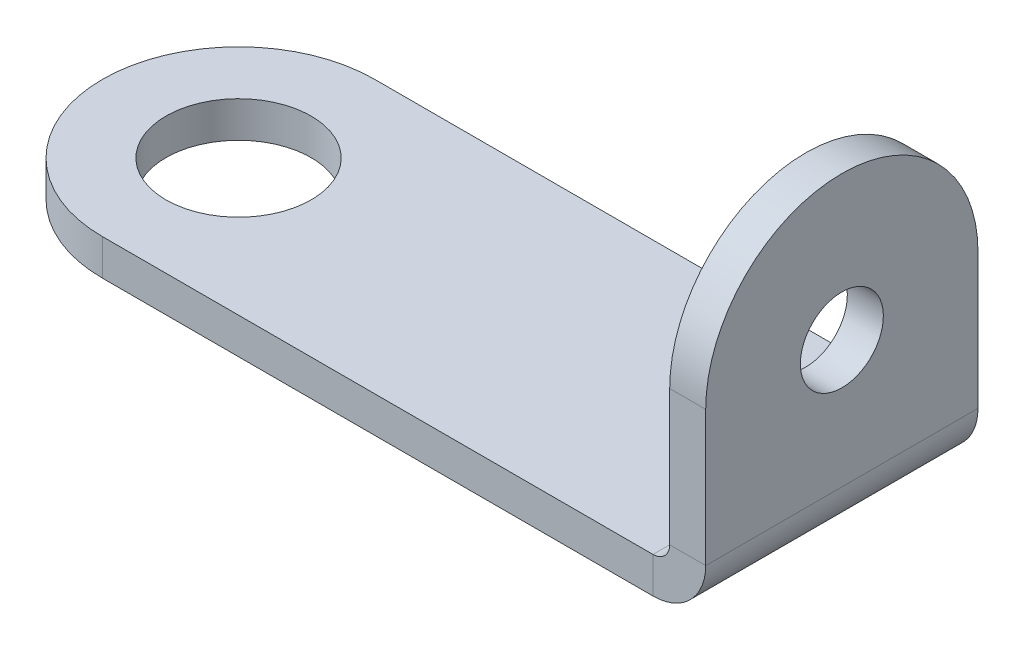
ISO-10303-21;
HEADER;
FILE_DESCRIPTION(('STEP AP214'),'2;1');
FILE_NAME('part.step','',(''),(''),'','','');
FILE_SCHEMA(('AUTOMOTIVE_DESIGN { 1 0 10303 214 1 1 1 1 }'));
ENDSEC;
DATA;
#1=APPLICATION_CONTEXT('core data for automotive mechanical design processes');
#2=APPLICATION_PROTOCOL_DEFINITION('international standard','automotive_design',2000,#1);
#3=PRODUCT_CONTEXT('',#1,'mechanical');
#4=PRODUCT('Part','Part','',(#3));
#5=PRODUCT_RELATED_PRODUCT_CATEGORY('part','',(#4));
#6=PRODUCT_DEFINITION_FORMATION('','',#4);
#7=PRODUCT_DEFINITION_CONTEXT('part definition',#1,'design');
#8=PRODUCT_DEFINITION('design','',#6,#7);
#9=PRODUCT_DEFINITION_SHAPE('','',#8);
#10=(LENGTH_UNIT() NAMED_UNIT(*) SI_UNIT(.MILLI.,.METRE.));
#11=(NAMED_UNIT(*) PLANE_ANGLE_UNIT() SI_UNIT($,.RADIAN.));
#12=(NAMED_UNIT(*) SI_UNIT($,.STERADIAN.) SOLID_ANGLE_UNIT());
#13=UNCERTAINTY_MEASURE_WITH_UNIT(LENGTH_MEASURE(1.E-05),#10,'distance_accuracy_value','');
#14=(GEOMETRIC_REPRESENTATION_CONTEXT(3) GLOBAL_UNCERTAINTY_ASSIGNED_CONTEXT((#13)) GLOBAL_UNIT_ASSIGNED_CONTEXT((#10,
#11,#12)) REPRESENTATION_CONTEXT('',''));
#15=CARTESIAN_POINT('',(0.,0.,0.));
#16=DIRECTION('',(0.,0.,1.));
#17=DIRECTION('',(1.,0.,0.));
#18=AXIS2_PLACEMENT_3D('',#15,#16,#17);
#19=CARTESIAN_POINT('',(26.5875,8.28749999999999,0.));
#20=DIRECTION('',(-1.,0.,0.));
#21=DIRECTION('',(0.,-1.,0.));
#22=AXIS2_PLACEMENT_3D('',#19,#20,#21);
#23=CYLINDRICAL_SURFACE('',#22,6.);
#24=DIRECTION('',(-1.,0.,0.));
#25=VECTOR('',#24,1.);
#26=CARTESIAN_POINT('',(26.5875,8.28749999999999,6.));
#27=LINE('',#26,#25);
#28=CARTESIAN_POINT('',(26.5875,8.28749999999999,6.));
#29=VERTEX_POINT('',#28);
#30=CARTESIAN_POINT('',(25.,8.2875,6.));
#31=VERTEX_POINT('',#30);
#32=EDGE_CURVE('E188',#29,#31,#27,.T.);
#33=ORIENTED_EDGE('',*,*,#32,.F.);
#34=CARTESIAN_POINT('',(26.5875,8.28749999999999,0.));
#35=DIRECTION('',(-1.,0.,0.));
#36=DIRECTION('',(0.,-1.,0.));
#37=AXIS2_PLACEMENT_3D('',#34,#35,#36);
#38=CIRCLE('',#37,6.);
#39=CARTESIAN_POINT('',(26.5875,8.28749999999999,-6.));
#40=VERTEX_POINT('',#39);
#41=EDGE_CURVE('E49',#40,#29,#38,.F.);
#42=ORIENTED_EDGE('',*,*,#41,.F.);
#43=DIRECTION('',(-1.,0.,0.));
#44=VECTOR('',#43,1.);
#45=CARTESIAN_POINT('',(26.5875,8.28749999999999,-6.));
#46=LINE('',#45,#44);
#47=CARTESIAN_POINT('',(25.,8.2875,-6.));
#48=VERTEX_POINT('',#47);
#49=EDGE_CURVE('E137',#48,#40,#46,.F.);
#50=ORIENTED_EDGE('',*,*,#49,.F.);
#51=CARTESIAN_POINT('',(25.,8.2875,0.));
#52=DIRECTION('',(-1.,0.,0.));
#53=DIRECTION('',(0.,-1.,0.));
#54=AXIS2_PLACEMENT_3D('',#51,#52,#53);
#55=CIRCLE('',#54,6.);
#56=EDGE_CURVE('E11',#31,#48,#55,.T.);
#57=ORIENTED_EDGE('',*,*,#56,.F.);
#58=EDGE_LOOP('',(#33,#42,#50,#57));
#59=FACE_BOUND('',#58,.T.);
#60=ADVANCED_FACE('F41',(#59),#23,.T.);
#61=CARTESIAN_POINT('',(0.,1.5875,0.));
#62=DIRECTION('',(0.,1.,0.));
#63=DIRECTION('',(0.,0.,1.));
#64=AXIS2_PLACEMENT_3D('',#61,#62,#63);
#65=PLANE('',#64);
#66=CARTESIAN_POINT('',(0.,1.5875,0.));
#67=DIRECTION('',(0.,1.,0.));
#68=DIRECTION('',(0.,0.,1.));
#69=AXIS2_PLACEMENT_3D('',#66,#67,#68);
#70=CIRCLE('',#69,3.19999999999999);
#71=CARTESIAN_POINT('',(0.,1.5875,3.19999999999999));
#72=VERTEX_POINT('',#71);
#73=EDGE_CURVE('E161',#72,#72,#70,.T.);
#74=ORIENTED_EDGE('',*,*,#73,.F.);
#75=EDGE_LOOP('',(#74));
#76=FACE_BOUND('',#75,.T.);
#77=DIRECTION('',(1.,0.,0.));
#78=VECTOR('',#77,1.);
#79=CARTESIAN_POINT('',(0.,1.5875,6.));
#80=LINE('',#79,#78);
#81=CARTESIAN_POINT('',(0.,1.5875,6.));
#82=VERTEX_POINT('',#81);
#83=CARTESIAN_POINT('',(24.2634,1.5875,6.));
#84=VERTEX_POINT('',#83);
#85=EDGE_CURVE('E170',#82,#84,#80,.T.);
#86=ORIENTED_EDGE('',*,*,#85,.T.);
#87=DIRECTION('',(0.,0.,-1.));
#88=VECTOR('',#87,1.);
#89=CARTESIAN_POINT('',(24.2634,1.5875,-6.));
#90=LINE('',#89,#88);
#91=CARTESIAN_POINT('',(24.2634,1.5875,-6.));
#92=VERTEX_POINT('',#91);
#93=EDGE_CURVE('E151',#92,#84,#90,.F.);
#94=ORIENTED_EDGE('',*,*,#93,.F.);
#95=DIRECTION('',(-1.,0.,0.));
#96=VECTOR('',#95,1.);
#97=CARTESIAN_POINT('',(0.,1.5875,-6.));
#98=LINE('',#97,#96);
#99=CARTESIAN_POINT('',(0.,1.5875,-6.));
#100=VERTEX_POINT('',#99);
#101=EDGE_CURVE('E174',#92,#100,#98,.T.);
#102=ORIENTED_EDGE('',*,*,#101,.T.);
#103=CARTESIAN_POINT('',(0.,1.5875,0.));
#104=DIRECTION('',(0.,1.,0.));
#105=DIRECTION('',(0.,0.,1.));
#106=AXIS2_PLACEMENT_3D('',#103,#104,#105);
#107=CIRCLE('',#106,6.);
#108=EDGE_CURVE('E167',#100,#82,#107,.T.);
#109=ORIENTED_EDGE('',*,*,#108,.T.);
#110=EDGE_LOOP('',(#86,#94,#102,#109));
#111=FACE_BOUND('',#110,.T.);
#112=ADVANCED_FACE('F220',(#76,#111),#65,.T.);
#113=CARTESIAN_POINT('',(0.,0.,0.));
#114=DIRECTION('',(0.,1.,0.));
#115=DIRECTION('',(0.,0.,1.));
#116=AXIS2_PLACEMENT_3D('',#113,#114,#115);
#117=PLANE('',#116);
#118=CARTESIAN_POINT('',(0.,0.,0.));
#119=DIRECTION('',(0.,1.,0.));
#120=DIRECTION('',(0.,0.,1.));
#121=AXIS2_PLACEMENT_3D('',#118,#119,#120);
#122=CIRCLE('',#121,3.19999999999999);
#123=CARTESIAN_POINT('',(0.,0.,3.19999999999999));
#124=VERTEX_POINT('',#123);
#125=EDGE_CURVE('E158',#124,#124,#122,.T.);
#126=ORIENTED_EDGE('',*,*,#125,.T.);
#127=EDGE_LOOP('',(#126));
#128=FACE_BOUND('',#127,.T.);
#129=DIRECTION('',(0.,0.,-1.));
#130=VECTOR('',#129,1.);
#131=CARTESIAN_POINT('',(24.2634,0.,-6.));
#132=LINE('',#131,#130);
#133=CARTESIAN_POINT('',(24.2634,0.,-6.));
#134=VERTEX_POINT('',#133);
#135=CARTESIAN_POINT('',(24.2634,0.,6.));
#136=VERTEX_POINT('',#135);
#137=EDGE_CURVE('E112',#134,#136,#132,.F.);
#138=ORIENTED_EDGE('',*,*,#137,.T.);
#139=DIRECTION('',(1.,0.,0.));
#140=VECTOR('',#139,1.);
#141=CARTESIAN_POINT('',(0.,0.,6.));
#142=LINE('',#141,#140);
#143=CARTESIAN_POINT('',(0.,0.,6.));
#144=VERTEX_POINT('',#143);
#145=EDGE_CURVE('E179',#144,#136,#142,.T.);
#146=ORIENTED_EDGE('',*,*,#145,.F.);
#147=CARTESIAN_POINT('',(0.,0.,0.));
#148=DIRECTION('',(0.,1.,0.));
#149=DIRECTION('',(0.,0.,1.));
#150=AXIS2_PLACEMENT_3D('',#147,#148,#149);
#151=CIRCLE('',#150,6.);
#152=CARTESIAN_POINT('',(0.,0.,-6.));
#153=VERTEX_POINT('',#152);
#154=EDGE_CURVE('E164',#153,#144,#151,.T.);
#155=ORIENTED_EDGE('',*,*,#154,.F.);
#156=DIRECTION('',(-1.,0.,0.));
#157=VECTOR('',#156,1.);
#158=CARTESIAN_POINT('',(0.,0.,-6.));
#159=LINE('',#158,#157);
#160=EDGE_CURVE('E171',#134,#153,#159,.T.);
#161=ORIENTED_EDGE('',*,*,#160,.F.);
#162=EDGE_LOOP('',(#138,#146,#155,#161));
#163=FACE_BOUND('',#162,.T.);
#164=ADVANCED_FACE('F228',(#128,#163),#117,.F.);
#165=CARTESIAN_POINT('',(0.,1.5875,6.));
#166=DIRECTION('',(0.,0.,-1.));
#167=DIRECTION('',(-1.,0.,0.));
#168=AXIS2_PLACEMENT_3D('',#165,#166,#167);
#169=PLANE('',#168);
#170=DIRECTION('',(0.,-1.,0.));
#171=VECTOR('',#170,1.);
#172=CARTESIAN_POINT('',(24.2634,1.5875,6.));
#173=LINE('',#172,#171);
#174=EDGE_CURVE('E155',#84,#136,#173,.T.);
#175=ORIENTED_EDGE('',*,*,#174,.F.);
#176=ORIENTED_EDGE('',*,*,#85,.F.);
#177=DIRECTION('',(0.,-1.,0.));
#178=VECTOR('',#177,1.);
#179=CARTESIAN_POINT('',(0.,1.5875,6.));
#180=LINE('',#179,#178);
#181=EDGE_CURVE('E185',#82,#144,#180,.T.);
#182=ORIENTED_EDGE('',*,*,#181,.T.);
#183=ORIENTED_EDGE('',*,*,#145,.T.);
#184=EDGE_LOOP('',(#175,#176,#182,#183));
#185=FACE_BOUND('',#184,.T.);
#186=ADVANCED_FACE('F218',(#185),#169,.F.);
#187=CARTESIAN_POINT('',(0.,1.5875,-6.));
#188=DIRECTION('',(0.,0.,1.));
#189=DIRECTION('',(1.,0.,0.));
#190=AXIS2_PLACEMENT_3D('',#187,#188,#189);
#191=PLANE('',#190);
#192=DIRECTION('',(0.,-1.,0.));
#193=VECTOR('',#192,1.);
#194=CARTESIAN_POINT('',(24.2634,1.5875,-6.));
#195=LINE('',#194,#193);
#196=EDGE_CURVE('E147',#92,#134,#195,.T.);
#197=ORIENTED_EDGE('',*,*,#196,.T.);
#198=ORIENTED_EDGE('',*,*,#160,.T.);
#199=DIRECTION('',(0.,-1.,0.));
#200=VECTOR('',#199,1.);
#201=CARTESIAN_POINT('',(0.,1.5875,-6.));
#202=LINE('',#201,#200);
#203=EDGE_CURVE('E176',#100,#153,#202,.T.);
#204=ORIENTED_EDGE('',*,*,#203,.F.);
#205=ORIENTED_EDGE('',*,*,#101,.F.);
#206=EDGE_LOOP('',(#197,#198,#204,#205));
#207=FACE_BOUND('',#206,.T.);
#208=ADVANCED_FACE('F230',(#207),#191,.F.);
#209=CARTESIAN_POINT('',(0.,1.5875,0.));
#210=DIRECTION('',(0.,-1.,0.));
#211=DIRECTION('',(0.,0.,-1.));
#212=AXIS2_PLACEMENT_3D('',#209,#210,#211);
#213=CYLINDRICAL_SURFACE('',#212,6.);
#214=ORIENTED_EDGE('',*,*,#154,.T.);
#215=ORIENTED_EDGE('',*,*,#181,.F.);
#216=ORIENTED_EDGE('',*,*,#108,.F.);
#217=ORIENTED_EDGE('',*,*,#203,.T.);
#218=EDGE_LOOP('',(#214,#215,#216,#217));
#219=FACE_BOUND('',#218,.T.);
#220=ADVANCED_FACE('F225',(#219),#213,.T.);
#221=CARTESIAN_POINT('',(0.,1.5875,0.));
#222=DIRECTION('',(0.,-1.,0.));
#223=DIRECTION('',(0.,0.,-1.));
#224=AXIS2_PLACEMENT_3D('',#221,#222,#223);
#225=CYLINDRICAL_SURFACE('',#224,3.19999999999999);
#226=ORIENTED_EDGE('',*,*,#73,.T.);
#227=EDGE_LOOP('',(#226));
#228=FACE_BOUND('',#227,.T.);
#229=ORIENTED_EDGE('',*,*,#125,.F.);
#230=EDGE_LOOP('',(#229));
#231=FACE_BOUND('',#230,.T.);
#232=ADVANCED_FACE('F237',(#228,#231),#225,.F.);
#233=CARTESIAN_POINT('',(24.2634,2.3241,6.));
#234=DIRECTION('',(0.,0.,1.));
#235=DIRECTION('',(1.,0.,0.));
#236=AXIS2_PLACEMENT_3D('',#233,#234,#235);
#237=PLANE('',#236);
#238=DIRECTION('',(1.,0.,0.));
#239=VECTOR('',#238,1.);
#240=CARTESIAN_POINT('',(25.,2.3241,6.));
#241=LINE('',#240,#239);
#242=CARTESIAN_POINT('',(25.,2.3241,6.));
#243=VERTEX_POINT('',#242);
#244=CARTESIAN_POINT('',(26.5875,2.32409999999999,6.));
#245=VERTEX_POINT('',#244);
#246=EDGE_CURVE('E195',#243,#245,#241,.T.);
#247=ORIENTED_EDGE('',*,*,#246,.F.);
#248=CARTESIAN_POINT('',(24.2634,2.3241,6.));
#249=DIRECTION('',(0.,0.,-1.));
#250=DIRECTION('',(-1.,0.,0.));
#251=AXIS2_PLACEMENT_3D('',#248,#249,#250);
#252=CIRCLE('',#251,0.7366);
#253=EDGE_CURVE('E115',#84,#243,#252,.F.);
#254=ORIENTED_EDGE('',*,*,#253,.F.);
#255=ORIENTED_EDGE('',*,*,#174,.T.);
#256=CARTESIAN_POINT('',(24.2634,2.3241,6.));
#257=DIRECTION('',(0.,0.,-1.));
#258=DIRECTION('',(-1.,0.,0.));
#259=AXIS2_PLACEMENT_3D('',#256,#257,#258);
#260=CIRCLE('',#259,2.3241);
#261=EDGE_CURVE('E146',#136,#245,#260,.F.);
#262=ORIENTED_EDGE('',*,*,#261,.T.);
#263=EDGE_LOOP('',(#247,#254,#255,#262));
#264=FACE_BOUND('',#263,.T.);
#265=ADVANCED_FACE('F216',(#264),#237,.T.);
#266=CARTESIAN_POINT('',(24.2634,2.3241,-6.));
#267=DIRECTION('',(0.,0.,1.));
#268=DIRECTION('',(1.,0.,0.));
#269=AXIS2_PLACEMENT_3D('',#266,#267,#268);
#270=PLANE('',#269);
#271=CARTESIAN_POINT('',(24.2634,2.3241,-6.));
#272=DIRECTION('',(0.,0.,-1.));
#273=DIRECTION('',(-1.,0.,0.));
#274=AXIS2_PLACEMENT_3D('',#271,#272,#273);
#275=CIRCLE('',#274,0.7366);
#276=CARTESIAN_POINT('',(25.,2.3241,-6.));
#277=VERTEX_POINT('',#276);
#278=EDGE_CURVE('E122',#277,#92,#275,.T.);
#279=ORIENTED_EDGE('',*,*,#278,.F.);
#280=DIRECTION('',(1.,0.,0.));
#281=VECTOR('',#280,1.);
#282=CARTESIAN_POINT('',(25.,2.3241,-6.));
#283=LINE('',#282,#281);
#284=CARTESIAN_POINT('',(26.5875,2.32409999999999,-6.));
#285=VERTEX_POINT('',#284);
#286=EDGE_CURVE('E119',#277,#285,#283,.T.);
#287=ORIENTED_EDGE('',*,*,#286,.T.);
#288=CARTESIAN_POINT('',(24.2634,2.3241,-6.));
#289=DIRECTION('',(0.,0.,-1.));
#290=DIRECTION('',(-1.,0.,0.));
#291=AXIS2_PLACEMENT_3D('',#288,#289,#290);
#292=CIRCLE('',#291,2.3241);
#293=EDGE_CURVE('E105',#285,#134,#292,.T.);
#294=ORIENTED_EDGE('',*,*,#293,.T.);
#295=ORIENTED_EDGE('',*,*,#196,.F.);
#296=EDGE_LOOP('',(#279,#287,#294,#295));
#297=FACE_BOUND('',#296,.T.);
#298=ADVANCED_FACE('F120',(#297),#270,.F.);
#299=CARTESIAN_POINT('',(24.2634,2.3241,-6.));
#300=DIRECTION('',(0.,0.,-1.));
#301=DIRECTION('',(1.,0.,0.));
#302=AXIS2_PLACEMENT_3D('',#299,#300,#301);
#303=CYLINDRICAL_SURFACE('',#302,2.3241);
#304=ORIENTED_EDGE('',*,*,#137,.F.);
#305=ORIENTED_EDGE('',*,*,#293,.F.);
#306=DIRECTION('',(0.,0.,1.));
#307=VECTOR('',#306,1.);
#308=CARTESIAN_POINT('',(26.5875,2.32409999999999,0.));
#309=LINE('',#308,#307);
#310=EDGE_CURVE('E110',#285,#245,#309,.T.);
#311=ORIENTED_EDGE('',*,*,#310,.T.);
#312=ORIENTED_EDGE('',*,*,#261,.F.);
#313=EDGE_LOOP('',(#304,#305,#311,#312));
#314=FACE_BOUND('',#313,.T.);
#315=ADVANCED_FACE('F107',(#314),#303,.T.);
#316=CARTESIAN_POINT('',(24.2634,2.3241,-6.));
#317=DIRECTION('',(0.,0.,-1.));
#318=DIRECTION('',(1.,0.,0.));
#319=AXIS2_PLACEMENT_3D('',#316,#317,#318);
#320=CYLINDRICAL_SURFACE('',#319,0.7366);
#321=ORIENTED_EDGE('',*,*,#93,.T.);
#322=ORIENTED_EDGE('',*,*,#253,.T.);
#323=DIRECTION('',(0.,0.,-1.));
#324=VECTOR('',#323,1.);
#325=CARTESIAN_POINT('',(25.,2.3241,6.));
#326=LINE('',#325,#324);
#327=EDGE_CURVE('E126',#243,#277,#326,.T.);
#328=ORIENTED_EDGE('',*,*,#327,.T.);
#329=ORIENTED_EDGE('',*,*,#278,.T.);
#330=EDGE_LOOP('',(#321,#322,#328,#329));
#331=FACE_BOUND('',#330,.T.);
#332=ADVANCED_FACE('F214',(#331),#320,.F.);
#333=CARTESIAN_POINT('',(26.5875,14.2875,-6.));
#334=DIRECTION('',(0.,0.,1.));
#335=DIRECTION('',(1.,0.,0.));
#336=AXIS2_PLACEMENT_3D('',#333,#334,#335);
#337=PLANE('',#336);
#338=DIRECTION('',(0.,1.,0.));
#339=VECTOR('',#338,1.);
#340=CARTESIAN_POINT('',(25.,14.2875,-6.));
#341=LINE('',#340,#339);
#342=EDGE_CURVE('E134',#277,#48,#341,.T.);
#343=ORIENTED_EDGE('',*,*,#342,.T.);
#344=ORIENTED_EDGE('',*,*,#49,.T.);
#345=DIRECTION('',(0.,1.,0.));
#346=VECTOR('',#345,1.);
#347=CARTESIAN_POINT('',(26.5875,14.2875,-6.));
#348=LINE('',#347,#346);
#349=EDGE_CURVE('E131',#285,#40,#348,.T.);
#350=ORIENTED_EDGE('',*,*,#349,.F.);
#351=ORIENTED_EDGE('',*,*,#286,.F.);
#352=EDGE_LOOP('',(#343,#344,#350,#351));
#353=FACE_BOUND('',#352,.T.);
#354=ADVANCED_FACE('F136',(#353),#337,.F.);
#355=CARTESIAN_POINT('',(26.5875,1.58749999999999,6.));
#356=DIRECTION('',(0.,0.,-1.));
#357=DIRECTION('',(-1.,0.,0.));
#358=AXIS2_PLACEMENT_3D('',#355,#356,#357);
#359=PLANE('',#358);
#360=DIRECTION('',(0.,-1.,0.));
#361=VECTOR('',#360,1.);
#362=CARTESIAN_POINT('',(26.5875,1.58749999999999,6.));
#363=LINE('',#362,#361);
#364=EDGE_CURVE('E133',#29,#245,#363,.T.);
#365=ORIENTED_EDGE('',*,*,#364,.F.);
#366=ORIENTED_EDGE('',*,*,#32,.T.);
#367=DIRECTION('',(0.,-1.,0.));
#368=VECTOR('',#367,1.);
#369=CARTESIAN_POINT('',(25.,1.5875,6.));
#370=LINE('',#369,#368);
#371=EDGE_CURVE('E138',#31,#243,#370,.T.);
#372=ORIENTED_EDGE('',*,*,#371,.T.);
#373=ORIENTED_EDGE('',*,*,#246,.T.);
#374=EDGE_LOOP('',(#365,#366,#372,#373));
#375=FACE_BOUND('',#374,.T.);
#376=ADVANCED_FACE('F193',(#375),#359,.F.);
#377=CARTESIAN_POINT('',(26.5875,0.,0.));
#378=DIRECTION('',(-1.,0.,0.));
#379=DIRECTION('',(0.,-1.,0.));
#380=AXIS2_PLACEMENT_3D('',#377,#378,#379);
#381=PLANE('',#380);
#382=CARTESIAN_POINT('',(26.5875000000001,7.93750000000001,0.));
#383=DIRECTION('',(-1.,0.,0.));
#384=DIRECTION('',(0.,-1.,0.));
#385=AXIS2_PLACEMENT_3D('',#382,#383,#384);
#386=CIRCLE('',#385,1.8288);
#387=CARTESIAN_POINT('',(26.5875000000001,6.10870000000001,0.));
#388=VERTEX_POINT('',#387);
#389=EDGE_CURVE('E198',#388,#388,#386,.T.);
#390=ORIENTED_EDGE('',*,*,#389,.T.);
#391=EDGE_LOOP('',(#390));
#392=FACE_BOUND('',#391,.T.);
#393=ORIENTED_EDGE('',*,*,#349,.T.);
#394=ORIENTED_EDGE('',*,*,#41,.T.);
#395=ORIENTED_EDGE('',*,*,#364,.T.);
#396=ORIENTED_EDGE('',*,*,#310,.F.);
#397=EDGE_LOOP('',(#393,#394,#395,#396));
#398=FACE_BOUND('',#397,.T.);
#399=ADVANCED_FACE('F130',(#392,#398),#381,.F.);
#400=CARTESIAN_POINT('',(25.,0.,0.));
#401=DIRECTION('',(-1.,0.,0.));
#402=DIRECTION('',(0.,-1.,0.));
#403=AXIS2_PLACEMENT_3D('',#400,#401,#402);
#404=PLANE('',#403);
#405=CARTESIAN_POINT('',(25.,7.93750000000002,0.));
#406=DIRECTION('',(-1.,0.,0.));
#407=DIRECTION('',(0.,-1.,0.));
#408=AXIS2_PLACEMENT_3D('',#405,#406,#407);
#409=CIRCLE('',#408,1.8288);
#410=CARTESIAN_POINT('',(25.,6.10870000000002,0.));
#411=VERTEX_POINT('',#410);
#412=EDGE_CURVE('E201',#411,#411,#409,.T.);
#413=ORIENTED_EDGE('',*,*,#412,.F.);
#414=EDGE_LOOP('',(#413));
#415=FACE_BOUND('',#414,.T.);
#416=ORIENTED_EDGE('',*,*,#371,.F.);
#417=ORIENTED_EDGE('',*,*,#56,.T.);
#418=ORIENTED_EDGE('',*,*,#342,.F.);
#419=ORIENTED_EDGE('',*,*,#327,.F.);
#420=EDGE_LOOP('',(#416,#417,#418,#419));
#421=FACE_BOUND('',#420,.T.);
#422=ADVANCED_FACE('F209',(#415,#421),#404,.T.);
#423=CARTESIAN_POINT('',(26.5875000000001,7.93750000000001,0.));
#424=DIRECTION('',(-1.,0.,0.));
#425=DIRECTION('',(0.,-1.,0.));
#426=AXIS2_PLACEMENT_3D('',#423,#424,#425);
#427=CYLINDRICAL_SURFACE('',#426,1.8288);
#428=ORIENTED_EDGE('',*,*,#389,.F.);
#429=EDGE_LOOP('',(#428));
#430=FACE_BOUND('',#429,.T.);
#431=ORIENTED_EDGE('',*,*,#412,.T.);
#432=EDGE_LOOP('',(#431));
#433=FACE_BOUND('',#432,.T.);
#434=ADVANCED_FACE('F207',(#430,#433),#427,.F.);
#435=CLOSED_SHELL('',(#60,#112,#164,#186,#208,#220,#232,#265,#298,#315,#332,#354,#376,#399,#422,#434));
#436=MANIFOLD_SOLID_BREP('B2',#435);
#437=ADVANCED_BREP_SHAPE_REPRESENTATION('',(#18,#436),#14);
#438=SHAPE_DEFINITION_REPRESENTATION(#9,#437);
ENDSEC;
END-ISO-10303-21;
